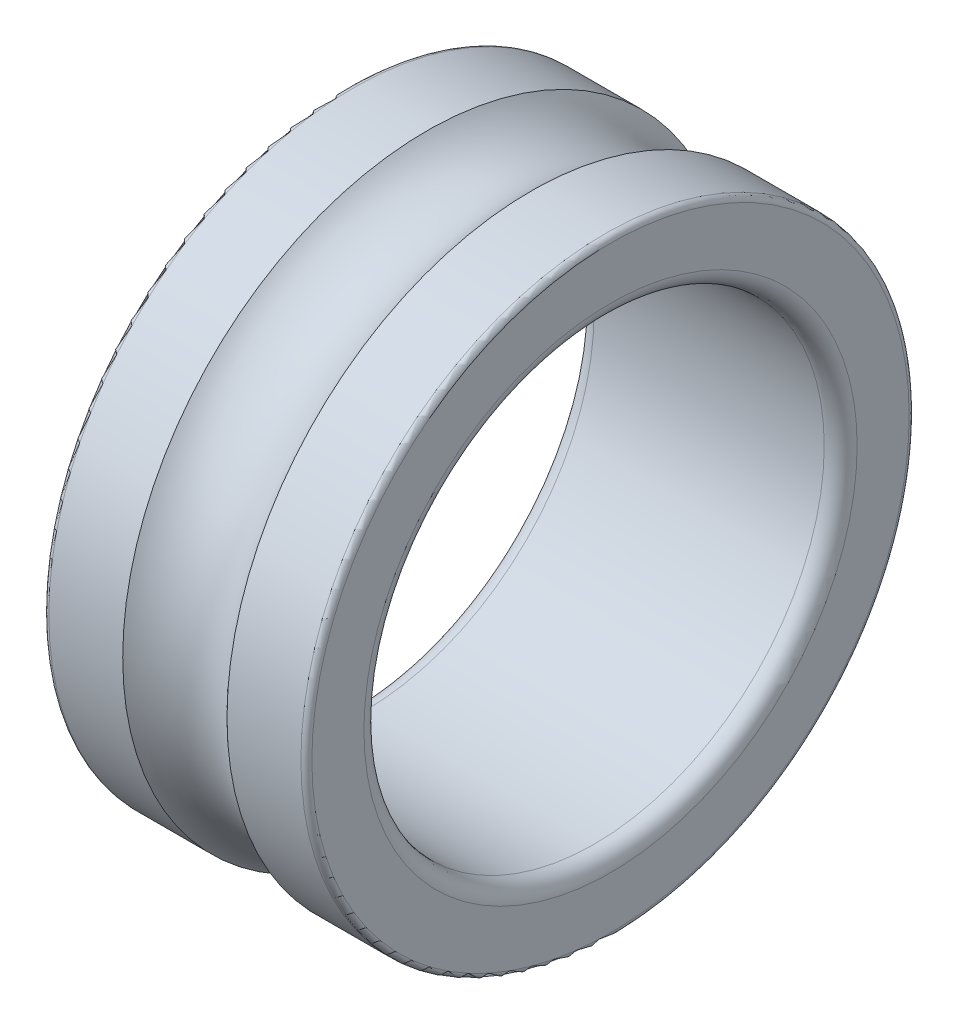
ISO-10303-21;
HEADER;
FILE_DESCRIPTION(('STEP AP214'),'2;1');
FILE_NAME('part.step','',(''),(''),'','','');
FILE_SCHEMA(('AUTOMOTIVE_DESIGN { 1 0 10303 214 1 1 1 1 }'));
ENDSEC;
DATA;
#1=APPLICATION_CONTEXT('core data for automotive mechanical design processes');
#2=APPLICATION_PROTOCOL_DEFINITION('international standard','automotive_design',2000,#1);
#3=PRODUCT_CONTEXT('',#1,'mechanical');
#4=PRODUCT('Part','Part','',(#3));
#5=PRODUCT_RELATED_PRODUCT_CATEGORY('part','',(#4));
#6=PRODUCT_DEFINITION_FORMATION('','',#4);
#7=PRODUCT_DEFINITION_CONTEXT('part definition',#1,'design');
#8=PRODUCT_DEFINITION('design','',#6,#7);
#9=PRODUCT_DEFINITION_SHAPE('','',#8);
#10=(LENGTH_UNIT() NAMED_UNIT(*) SI_UNIT(.MILLI.,.METRE.));
#11=(NAMED_UNIT(*) PLANE_ANGLE_UNIT() SI_UNIT($,.RADIAN.));
#12=(NAMED_UNIT(*) SI_UNIT($,.STERADIAN.) SOLID_ANGLE_UNIT());
#13=UNCERTAINTY_MEASURE_WITH_UNIT(LENGTH_MEASURE(1.E-05),#10,'distance_accuracy_value','');
#14=(GEOMETRIC_REPRESENTATION_CONTEXT(3) GLOBAL_UNCERTAINTY_ASSIGNED_CONTEXT((#13)) GLOBAL_UNIT_ASSIGNED_CONTEXT((#10,
#11,#12)) REPRESENTATION_CONTEXT('',''));
#15=CARTESIAN_POINT('',(0.,0.,0.));
#16=DIRECTION('',(0.,0.,1.));
#17=DIRECTION('',(1.,0.,0.));
#18=AXIS2_PLACEMENT_3D('',#15,#16,#17);
#19=CARTESIAN_POINT('',(0.,-18.5041369113276,-18.166666666667));
#20=DIRECTION('',(-1.,0.,0.));
#21=DIRECTION('',(0.,0.,1.));
#22=AXIS2_PLACEMENT_3D('',#19,#20,#21);
#23=PLANE('',#22);
#24=CARTESIAN_POINT('',(0.,0.,0.));
#25=DIRECTION('',(-1.,0.,0.));
#26=DIRECTION('',(0.,0.,-1.));
#27=AXIS2_PLACEMENT_3D('',#24,#25,#26);
#28=CIRCLE('',#27,18.166666666667);
#29=CARTESIAN_POINT('',(0.,0.,-18.166666666667));
#30=VERTEX_POINT('',#29);
#31=EDGE_CURVE('E50',#30,#30,#28,.F.);
#32=ORIENTED_EDGE('',*,*,#31,.F.);
#33=EDGE_LOOP('',(#32));
#34=FACE_BOUND('',#33,.T.);
#35=CARTESIAN_POINT('',(0.,0.,0.));
#36=DIRECTION('',(1.,0.,0.));
#37=DIRECTION('',(0.,0.,1.));
#38=AXIS2_PLACEMENT_3D('',#35,#36,#37);
#39=CIRCLE('',#38,15.0000000471208);
#40=CARTESIAN_POINT('',(0.,0.,15.0000000471208));
#41=VERTEX_POINT('',#40);
#42=EDGE_CURVE('E47',#41,#41,#39,.T.);
#43=ORIENTED_EDGE('',*,*,#42,.T.);
#44=EDGE_LOOP('',(#43));
#45=FACE_BOUND('',#44,.T.);
#46=ADVANCED_FACE('F15',(#34,#45),#23,.T.);
#47=CARTESIAN_POINT('',(16.,-18.5041368797212,18.166666666667));
#48=DIRECTION('',(1.,0.,0.));
#49=DIRECTION('',(0.,0.,-1.));
#50=AXIS2_PLACEMENT_3D('',#47,#48,#49);
#51=PLANE('',#50);
#52=CARTESIAN_POINT('',(16.,0.,0.));
#53=DIRECTION('',(1.,0.,0.));
#54=DIRECTION('',(0.,-1.16851419060691E-09,1.));
#55=AXIS2_PLACEMENT_3D('',#52,#53,#54);
#56=CIRCLE('',#55,18.1666667370862);
#57=CARTESIAN_POINT('',(16.,-2.12280078783117E-08,18.1666667370862));
#58=VERTEX_POINT('',#57);
#59=EDGE_CURVE('E44',#58,#58,#56,.T.);
#60=ORIENTED_EDGE('',*,*,#59,.T.);
#61=EDGE_LOOP('',(#60));
#62=FACE_BOUND('',#61,.T.);
#63=CARTESIAN_POINT('',(16.,0.,0.));
#64=DIRECTION('',(-1.,0.,0.));
#65=DIRECTION('',(0.,0.,-1.));
#66=AXIS2_PLACEMENT_3D('',#63,#64,#65);
#67=CIRCLE('',#66,15.0000000394232);
#68=CARTESIAN_POINT('',(16.,0.,-15.0000000394232));
#69=VERTEX_POINT('',#68);
#70=EDGE_CURVE('E41',#69,#69,#67,.F.);
#71=ORIENTED_EDGE('',*,*,#70,.F.);
#72=EDGE_LOOP('',(#71));
#73=FACE_BOUND('',#72,.T.);
#74=ADVANCED_FACE('F58',(#62,#73),#51,.T.);
#75=CARTESIAN_POINT('',(0.999999999999223,0.,0.));
#76=DIRECTION('',(1.,0.,0.));
#77=DIRECTION('',(0.,0.,1.));
#78=AXIS2_PLACEMENT_3D('',#75,#76,#77);
#79=TOROIDAL_SURFACE('',#78,14.9999999999992,0.999999999999223);
#80=CARTESIAN_POINT('',(1.,0.,0.));
#81=DIRECTION('',(1.,0.,0.));
#82=DIRECTION('',(0.,0.,1.));
#83=AXIS2_PLACEMENT_3D('',#80,#81,#82);
#84=CIRCLE('',#83,14.);
#85=CARTESIAN_POINT('',(1.,0.,14.));
#86=VERTEX_POINT('',#85);
#87=EDGE_CURVE('E38',#86,#86,#84,.T.);
#88=ORIENTED_EDGE('',*,*,#87,.T.);
#89=EDGE_LOOP('',(#88));
#90=FACE_BOUND('',#89,.T.);
#91=ORIENTED_EDGE('',*,*,#42,.F.);
#92=EDGE_LOOP('',(#91));
#93=FACE_BOUND('',#92,.T.);
#94=ADVANCED_FACE('F62',(#90,#93),#79,.T.);
#95=CARTESIAN_POINT('',(100.,0.,0.));
#96=DIRECTION('',(1.,0.,0.));
#97=DIRECTION('',(0.,0.,1.));
#98=AXIS2_PLACEMENT_3D('',#95,#96,#97);
#99=CYLINDRICAL_SURFACE('',#98,14.);
#100=CARTESIAN_POINT('',(15.,0.,0.));
#101=DIRECTION('',(1.,0.,0.));
#102=DIRECTION('',(0.,0.,1.));
#103=AXIS2_PLACEMENT_3D('',#100,#101,#102);
#104=CIRCLE('',#103,14.);
#105=CARTESIAN_POINT('',(15.,0.,14.));
#106=VERTEX_POINT('',#105);
#107=EDGE_CURVE('E35',#106,#106,#104,.T.);
#108=ORIENTED_EDGE('',*,*,#107,.T.);
#109=EDGE_LOOP('',(#108));
#110=FACE_BOUND('',#109,.T.);
#111=ORIENTED_EDGE('',*,*,#87,.F.);
#112=EDGE_LOOP('',(#111));
#113=FACE_BOUND('',#112,.T.);
#114=ADVANCED_FACE('F64',(#110,#113),#99,.F.);
#115=CARTESIAN_POINT('',(15.0000000000016,0.,0.));
#116=DIRECTION('',(1.,0.,0.));
#117=DIRECTION('',(0.,0.,1.));
#118=AXIS2_PLACEMENT_3D('',#115,#116,#117);
#119=TOROIDAL_SURFACE('',#118,14.9999999999984,0.99999999999845);
#120=ORIENTED_EDGE('',*,*,#70,.T.);
#121=EDGE_LOOP('',(#120));
#122=FACE_BOUND('',#121,.T.);
#123=ORIENTED_EDGE('',*,*,#107,.F.);
#124=EDGE_LOOP('',(#123));
#125=FACE_BOUND('',#124,.T.);
#126=ADVANCED_FACE('F72',(#122,#125),#119,.T.);
#127=CARTESIAN_POINT('',(15.6666666666661,0.,0.));
#128=DIRECTION('',(1.,0.,0.));
#129=DIRECTION('',(0.,0.,1.));
#130=AXIS2_PLACEMENT_3D('',#127,#128,#129);
#131=TOROIDAL_SURFACE('',#130,18.166666666666,0.333333333333956);
#132=CARTESIAN_POINT('',(15.6666666666661,0.,0.));
#133=DIRECTION('',(1.,0.,0.));
#134=DIRECTION('',(0.,0.,1.));
#135=AXIS2_PLACEMENT_3D('',#132,#133,#134);
#136=CIRCLE('',#135,18.5);
#137=CARTESIAN_POINT('',(15.6666666666661,0.,18.5));
#138=VERTEX_POINT('',#137);
#139=EDGE_CURVE('E30',#138,#138,#136,.T.);
#140=ORIENTED_EDGE('',*,*,#139,.T.);
#141=EDGE_LOOP('',(#140));
#142=FACE_BOUND('',#141,.T.);
#143=ORIENTED_EDGE('',*,*,#59,.F.);
#144=EDGE_LOOP('',(#143));
#145=FACE_BOUND('',#144,.T.);
#146=ADVANCED_FACE('F80',(#142,#145),#131,.T.);
#147=CARTESIAN_POINT('',(100.,0.,0.));
#148=DIRECTION('',(1.,0.,0.));
#149=DIRECTION('',(0.,0.,1.));
#150=AXIS2_PLACEMENT_3D('',#147,#148,#149);
#151=CYLINDRICAL_SURFACE('',#150,18.5);
#152=CARTESIAN_POINT('',(11.171370405676,0.,0.));
#153=DIRECTION('',(1.,0.,0.));
#154=DIRECTION('',(0.,0.,1.));
#155=AXIS2_PLACEMENT_3D('',#152,#153,#154);
#156=CIRCLE('',#155,18.5);
#157=CARTESIAN_POINT('',(11.171370405676,0.,18.5));
#158=VERTEX_POINT('',#157);
#159=EDGE_CURVE('E26',#158,#158,#156,.T.);
#160=ORIENTED_EDGE('',*,*,#159,.T.);
#161=EDGE_LOOP('',(#160));
#162=FACE_BOUND('',#161,.T.);
#163=ORIENTED_EDGE('',*,*,#139,.F.);
#164=EDGE_LOOP('',(#163));
#165=FACE_BOUND('',#164,.T.);
#166=ADVANCED_FACE('F84',(#162,#165),#151,.T.);
#167=CARTESIAN_POINT('',(7.9999999999998,0.,0.));
#168=DIRECTION('',(1.,0.,0.));
#169=DIRECTION('',(0.,7.6930474247214E-10,1.));
#170=AXIS2_PLACEMENT_3D('',#167,#168,#169);
#171=TOROIDAL_SURFACE('',#170,21.4999999999996,4.36549999999957);
#172=ORIENTED_EDGE('',*,*,#159,.F.);
#173=EDGE_LOOP('',(#172));
#174=FACE_BOUND('',#173,.T.);
#175=CARTESIAN_POINT('',(4.8286295943236,0.,0.));
#176=DIRECTION('',(1.,0.,0.));
#177=DIRECTION('',(0.,0.,1.));
#178=AXIS2_PLACEMENT_3D('',#175,#176,#177);
#179=CIRCLE('',#178,18.5);
#180=CARTESIAN_POINT('',(4.8286295943236,0.,18.5));
#181=VERTEX_POINT('',#180);
#182=EDGE_CURVE('E22',#181,#181,#179,.T.);
#183=ORIENTED_EDGE('',*,*,#182,.T.);
#184=EDGE_LOOP('',(#183));
#185=FACE_BOUND('',#184,.T.);
#186=ADVANCED_FACE('F88',(#174,#185),#171,.F.);
#187=CARTESIAN_POINT('',(100.,0.,0.));
#188=DIRECTION('',(1.,0.,0.));
#189=DIRECTION('',(0.,0.,1.));
#190=AXIS2_PLACEMENT_3D('',#187,#188,#189);
#191=CYLINDRICAL_SURFACE('',#190,18.5);
#192=CARTESIAN_POINT('',(0.333333333333329,0.,0.));
#193=DIRECTION('',(1.,0.,0.));
#194=DIRECTION('',(0.,0.,1.));
#195=AXIS2_PLACEMENT_3D('',#192,#193,#194);
#196=CIRCLE('',#195,18.5);
#197=CARTESIAN_POINT('',(0.333333333333329,0.,18.5));
#198=VERTEX_POINT('',#197);
#199=EDGE_CURVE('E10',#198,#198,#196,.T.);
#200=ORIENTED_EDGE('',*,*,#199,.T.);
#201=EDGE_LOOP('',(#200));
#202=FACE_BOUND('',#201,.T.);
#203=ORIENTED_EDGE('',*,*,#182,.F.);
#204=EDGE_LOOP('',(#203));
#205=FACE_BOUND('',#204,.T.);
#206=ADVANCED_FACE('F91',(#202,#205),#191,.T.);
#207=CARTESIAN_POINT('',(0.333333333333646,0.,0.));
#208=DIRECTION('',(1.,0.,0.));
#209=DIRECTION('',(0.,7.6930474247214E-10,1.));
#210=AXIS2_PLACEMENT_3D('',#207,#208,#209);
#211=TOROIDAL_SURFACE('',#210,18.1666666666663,0.333333333333644);
#212=ORIENTED_EDGE('',*,*,#31,.T.);
#213=EDGE_LOOP('',(#212));
#214=FACE_BOUND('',#213,.T.);
#215=ORIENTED_EDGE('',*,*,#199,.F.);
#216=EDGE_LOOP('',(#215));
#217=FACE_BOUND('',#216,.T.);
#218=ADVANCED_FACE('F17',(#214,#217),#211,.T.);
#219=CLOSED_SHELL('',(#46,#74,#94,#114,#126,#146,#166,#186,#206,#218));
#220=MANIFOLD_SOLID_BREP('B1',#219);
#221=ADVANCED_BREP_SHAPE_REPRESENTATION('',(#18,#220),#14);
#222=SHAPE_DEFINITION_REPRESENTATION(#9,#221);
ENDSEC;
END-ISO-10303-21;
